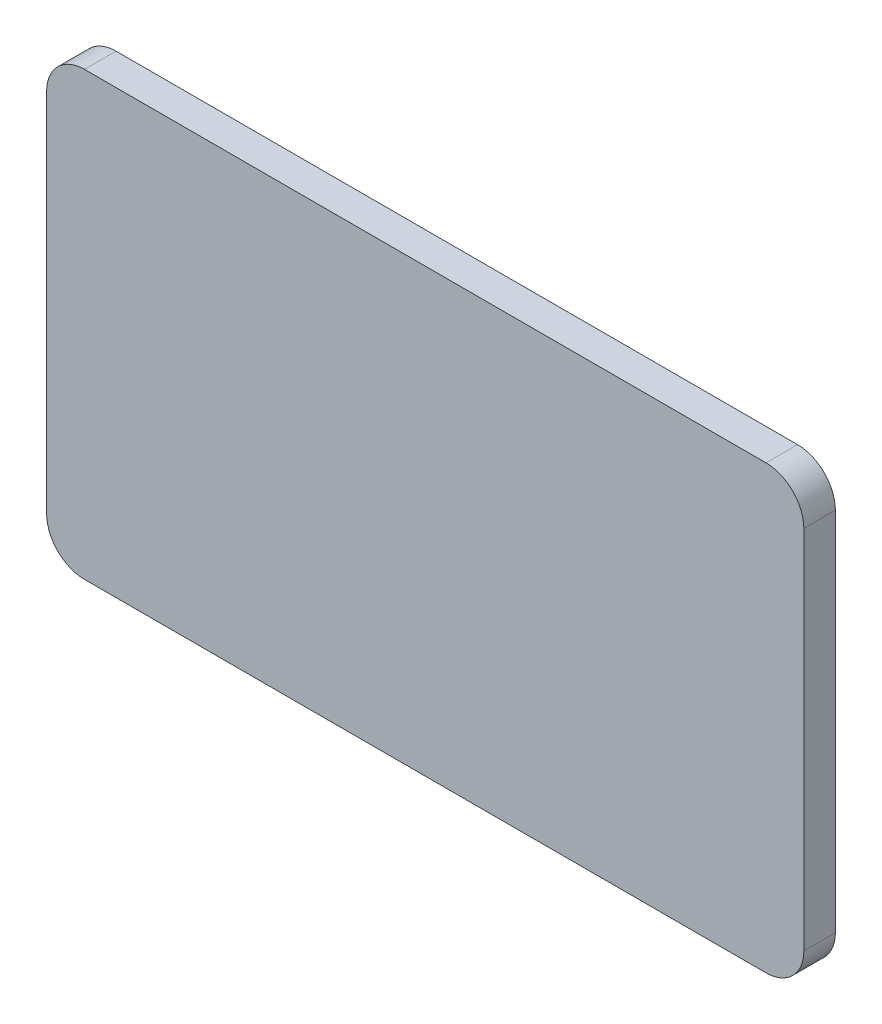
ISO-10303-21;
HEADER;
FILE_DESCRIPTION(('STEP AP214'),'2;1');
FILE_NAME('part.step','',(''),(''),'','','');
FILE_SCHEMA(('AUTOMOTIVE_DESIGN { 1 0 10303 214 1 1 1 1 }'));
ENDSEC;
DATA;
#1=APPLICATION_CONTEXT('core data for automotive mechanical design processes');
#2=APPLICATION_PROTOCOL_DEFINITION('international standard','automotive_design',2000,#1);
#3=PRODUCT_CONTEXT('',#1,'mechanical');
#4=PRODUCT('Part','Part','',(#3));
#5=PRODUCT_RELATED_PRODUCT_CATEGORY('part','',(#4));
#6=PRODUCT_DEFINITION_FORMATION('','',#4);
#7=PRODUCT_DEFINITION_CONTEXT('part definition',#1,'design');
#8=PRODUCT_DEFINITION('design','',#6,#7);
#9=PRODUCT_DEFINITION_SHAPE('','',#8);
#10=(LENGTH_UNIT() NAMED_UNIT(*) SI_UNIT(.MILLI.,.METRE.));
#11=(NAMED_UNIT(*) PLANE_ANGLE_UNIT() SI_UNIT($,.RADIAN.));
#12=(NAMED_UNIT(*) SI_UNIT($,.STERADIAN.) SOLID_ANGLE_UNIT());
#13=UNCERTAINTY_MEASURE_WITH_UNIT(LENGTH_MEASURE(1.E-05),#10,'distance_accuracy_value','');
#14=(GEOMETRIC_REPRESENTATION_CONTEXT(3) GLOBAL_UNCERTAINTY_ASSIGNED_CONTEXT((#13)) GLOBAL_UNIT_ASSIGNED_CONTEXT((#10,
#11,#12)) REPRESENTATION_CONTEXT('',''));
#15=CARTESIAN_POINT('',(0.,0.,0.));
#16=DIRECTION('',(0.,0.,1.));
#17=DIRECTION('',(1.,0.,0.));
#18=AXIS2_PLACEMENT_3D('',#15,#16,#17);
#19=CARTESIAN_POINT('',(27.,-14.5,2.5));
#20=DIRECTION('',(0.,0.,-1.));
#21=DIRECTION('',(-1.,0.,0.));
#22=AXIS2_PLACEMENT_3D('',#19,#20,#21);
#23=CYLINDRICAL_SURFACE('',#22,3.);
#24=CARTESIAN_POINT('',(27.,-14.5,0.));
#25=DIRECTION('',(0.,0.,1.));
#26=DIRECTION('',(1.,0.,0.));
#27=AXIS2_PLACEMENT_3D('',#24,#25,#26);
#28=CIRCLE('',#27,3.);
#29=CARTESIAN_POINT('',(27.,-17.5,0.));
#30=VERTEX_POINT('',#29);
#31=CARTESIAN_POINT('',(30.,-14.5,0.));
#32=VERTEX_POINT('',#31);
#33=EDGE_CURVE('E128',#30,#32,#28,.T.);
#34=ORIENTED_EDGE('',*,*,#33,.T.);
#35=DIRECTION('',(0.,0.,-1.));
#36=VECTOR('',#35,1.);
#37=CARTESIAN_POINT('',(30.,-14.5,2.5));
#38=LINE('',#37,#36);
#39=CARTESIAN_POINT('',(30.,-14.5,2.5));
#40=VERTEX_POINT('',#39);
#41=EDGE_CURVE('E11',#40,#32,#38,.T.);
#42=ORIENTED_EDGE('',*,*,#41,.F.);
#43=CARTESIAN_POINT('',(27.,-14.5,2.5));
#44=DIRECTION('',(0.,0.,1.));
#45=DIRECTION('',(1.,0.,0.));
#46=AXIS2_PLACEMENT_3D('',#43,#44,#45);
#47=CIRCLE('',#46,3.);
#48=CARTESIAN_POINT('',(27.,-17.5,2.5));
#49=VERTEX_POINT('',#48);
#50=EDGE_CURVE('E142',#49,#40,#47,.T.);
#51=ORIENTED_EDGE('',*,*,#50,.F.);
#52=DIRECTION('',(0.,0.,-1.));
#53=VECTOR('',#52,1.);
#54=CARTESIAN_POINT('',(27.,-17.5,2.5));
#55=LINE('',#54,#53);
#56=EDGE_CURVE('E124',#49,#30,#55,.T.);
#57=ORIENTED_EDGE('',*,*,#56,.T.);
#58=EDGE_LOOP('',(#34,#42,#51,#57));
#59=FACE_BOUND('',#58,.T.);
#60=ADVANCED_FACE('F32',(#59),#23,.T.);
#61=CARTESIAN_POINT('',(30.,-14.5,2.5));
#62=DIRECTION('',(-1.,0.,0.));
#63=DIRECTION('',(0.,0.,1.));
#64=AXIS2_PLACEMENT_3D('',#61,#62,#63);
#65=PLANE('',#64);
#66=DIRECTION('',(0.,1.,0.));
#67=VECTOR('',#66,1.);
#68=CARTESIAN_POINT('',(30.,-14.5,0.));
#69=LINE('',#68,#67);
#70=CARTESIAN_POINT('',(30.,14.5,0.));
#71=VERTEX_POINT('',#70);
#72=EDGE_CURVE('E131',#32,#71,#69,.T.);
#73=ORIENTED_EDGE('',*,*,#72,.T.);
#74=DIRECTION('',(0.,0.,-1.));
#75=VECTOR('',#74,1.);
#76=CARTESIAN_POINT('',(30.,14.5,2.5));
#77=LINE('',#76,#75);
#78=CARTESIAN_POINT('',(30.,14.5,2.5));
#79=VERTEX_POINT('',#78);
#80=EDGE_CURVE('E40',#79,#71,#77,.T.);
#81=ORIENTED_EDGE('',*,*,#80,.F.);
#82=DIRECTION('',(0.,1.,0.));
#83=VECTOR('',#82,1.);
#84=CARTESIAN_POINT('',(30.,-14.5,2.5));
#85=LINE('',#84,#83);
#86=EDGE_CURVE('E91',#40,#79,#85,.T.);
#87=ORIENTED_EDGE('',*,*,#86,.F.);
#88=ORIENTED_EDGE('',*,*,#41,.T.);
#89=EDGE_LOOP('',(#73,#81,#87,#88));
#90=FACE_BOUND('',#89,.T.);
#91=ADVANCED_FACE('F177',(#90),#65,.F.);
#92=CARTESIAN_POINT('',(27.,14.5,2.5));
#93=DIRECTION('',(0.,0.,-1.));
#94=DIRECTION('',(-1.,0.,0.));
#95=AXIS2_PLACEMENT_3D('',#92,#93,#94);
#96=CYLINDRICAL_SURFACE('',#95,3.);
#97=CARTESIAN_POINT('',(27.,14.5,0.));
#98=DIRECTION('',(0.,0.,1.));
#99=DIRECTION('',(-1.,0.,0.));
#100=AXIS2_PLACEMENT_3D('',#97,#98,#99);
#101=CIRCLE('',#100,3.);
#102=CARTESIAN_POINT('',(27.,17.5,0.));
#103=VERTEX_POINT('',#102);
#104=EDGE_CURVE('E133',#71,#103,#101,.T.);
#105=ORIENTED_EDGE('',*,*,#104,.T.);
#106=DIRECTION('',(0.,0.,-1.));
#107=VECTOR('',#106,1.);
#108=CARTESIAN_POINT('',(27.,17.5,2.5));
#109=LINE('',#108,#107);
#110=CARTESIAN_POINT('',(27.,17.5,2.5));
#111=VERTEX_POINT('',#110);
#112=EDGE_CURVE('E149',#111,#103,#109,.T.);
#113=ORIENTED_EDGE('',*,*,#112,.F.);
#114=CARTESIAN_POINT('',(27.,14.5,2.5));
#115=DIRECTION('',(0.,0.,1.));
#116=DIRECTION('',(-1.,0.,0.));
#117=AXIS2_PLACEMENT_3D('',#114,#115,#116);
#118=CIRCLE('',#117,3.);
#119=EDGE_CURVE('E157',#79,#111,#118,.T.);
#120=ORIENTED_EDGE('',*,*,#119,.F.);
#121=ORIENTED_EDGE('',*,*,#80,.T.);
#122=EDGE_LOOP('',(#105,#113,#120,#121));
#123=FACE_BOUND('',#122,.T.);
#124=ADVANCED_FACE('F155',(#123),#96,.T.);
#125=CARTESIAN_POINT('',(-27.,17.5,2.5));
#126=DIRECTION('',(0.,-1.,0.));
#127=DIRECTION('',(0.,0.,-1.));
#128=AXIS2_PLACEMENT_3D('',#125,#126,#127);
#129=PLANE('',#128);
#130=DIRECTION('',(-1.,0.,0.));
#131=VECTOR('',#130,1.);
#132=CARTESIAN_POINT('',(-27.,17.5,0.));
#133=LINE('',#132,#131);
#134=CARTESIAN_POINT('',(-27.,17.5,0.));
#135=VERTEX_POINT('',#134);
#136=EDGE_CURVE('E135',#103,#135,#133,.T.);
#137=ORIENTED_EDGE('',*,*,#136,.T.);
#138=DIRECTION('',(0.,0.,-1.));
#139=VECTOR('',#138,1.);
#140=CARTESIAN_POINT('',(-27.,17.5,2.5));
#141=LINE('',#140,#139);
#142=CARTESIAN_POINT('',(-27.,17.5,2.5));
#143=VERTEX_POINT('',#142);
#144=EDGE_CURVE('E146',#143,#135,#141,.T.);
#145=ORIENTED_EDGE('',*,*,#144,.F.);
#146=DIRECTION('',(-1.,0.,0.));
#147=VECTOR('',#146,1.);
#148=CARTESIAN_POINT('',(-27.,17.5,2.5));
#149=LINE('',#148,#147);
#150=EDGE_CURVE('E169',#111,#143,#149,.T.);
#151=ORIENTED_EDGE('',*,*,#150,.F.);
#152=ORIENTED_EDGE('',*,*,#112,.T.);
#153=EDGE_LOOP('',(#137,#145,#151,#152));
#154=FACE_BOUND('',#153,.T.);
#155=ADVANCED_FACE('F165',(#154),#129,.F.);
#156=CARTESIAN_POINT('',(-27.,14.5,2.5));
#157=DIRECTION('',(0.,0.,-1.));
#158=DIRECTION('',(-1.,0.,0.));
#159=AXIS2_PLACEMENT_3D('',#156,#157,#158);
#160=CYLINDRICAL_SURFACE('',#159,3.);
#161=CARTESIAN_POINT('',(-27.,14.5,0.));
#162=DIRECTION('',(0.,0.,1.));
#163=DIRECTION('',(-1.,0.,0.));
#164=AXIS2_PLACEMENT_3D('',#161,#162,#163);
#165=CIRCLE('',#164,3.);
#166=CARTESIAN_POINT('',(-30.,14.5,0.));
#167=VERTEX_POINT('',#166);
#168=EDGE_CURVE('E137',#135,#167,#165,.T.);
#169=ORIENTED_EDGE('',*,*,#168,.T.);
#170=DIRECTION('',(0.,0.,-1.));
#171=VECTOR('',#170,1.);
#172=CARTESIAN_POINT('',(-30.,14.5,2.5));
#173=LINE('',#172,#171);
#174=CARTESIAN_POINT('',(-30.,14.5,2.5));
#175=VERTEX_POINT('',#174);
#176=EDGE_CURVE('E119',#175,#167,#173,.T.);
#177=ORIENTED_EDGE('',*,*,#176,.F.);
#178=CARTESIAN_POINT('',(-27.,14.5,2.5));
#179=DIRECTION('',(0.,0.,1.));
#180=DIRECTION('',(-1.,0.,0.));
#181=AXIS2_PLACEMENT_3D('',#178,#179,#180);
#182=CIRCLE('',#181,3.);
#183=EDGE_CURVE('E110',#143,#175,#182,.T.);
#184=ORIENTED_EDGE('',*,*,#183,.F.);
#185=ORIENTED_EDGE('',*,*,#144,.T.);
#186=EDGE_LOOP('',(#169,#177,#184,#185));
#187=FACE_BOUND('',#186,.T.);
#188=ADVANCED_FACE('F168',(#187),#160,.T.);
#189=CARTESIAN_POINT('',(-30.,-14.5,2.5));
#190=DIRECTION('',(1.,0.,0.));
#191=DIRECTION('',(0.,0.,-1.));
#192=AXIS2_PLACEMENT_3D('',#189,#190,#191);
#193=PLANE('',#192);
#194=DIRECTION('',(0.,-1.,0.));
#195=VECTOR('',#194,1.);
#196=CARTESIAN_POINT('',(-30.,-14.5,0.));
#197=LINE('',#196,#195);
#198=CARTESIAN_POINT('',(-30.,-14.5,0.));
#199=VERTEX_POINT('',#198);
#200=EDGE_CURVE('E118',#167,#199,#197,.T.);
#201=ORIENTED_EDGE('',*,*,#200,.T.);
#202=DIRECTION('',(0.,0.,-1.));
#203=VECTOR('',#202,1.);
#204=CARTESIAN_POINT('',(-30.,-14.5,2.5));
#205=LINE('',#204,#203);
#206=CARTESIAN_POINT('',(-30.,-14.5,2.5));
#207=VERTEX_POINT('',#206);
#208=EDGE_CURVE('E115',#207,#199,#205,.T.);
#209=ORIENTED_EDGE('',*,*,#208,.F.);
#210=DIRECTION('',(0.,-1.,0.));
#211=VECTOR('',#210,1.);
#212=CARTESIAN_POINT('',(-30.,-14.5,2.5));
#213=LINE('',#212,#211);
#214=EDGE_CURVE('E104',#175,#207,#213,.T.);
#215=ORIENTED_EDGE('',*,*,#214,.F.);
#216=ORIENTED_EDGE('',*,*,#176,.T.);
#217=EDGE_LOOP('',(#201,#209,#215,#216));
#218=FACE_BOUND('',#217,.T.);
#219=ADVANCED_FACE('F116',(#218),#193,.F.);
#220=CARTESIAN_POINT('',(-27.,-14.5,2.5));
#221=DIRECTION('',(0.,0.,-1.));
#222=DIRECTION('',(-1.,0.,0.));
#223=AXIS2_PLACEMENT_3D('',#220,#221,#222);
#224=CYLINDRICAL_SURFACE('',#223,3.);
#225=CARTESIAN_POINT('',(-27.,-14.5,0.));
#226=DIRECTION('',(0.,0.,1.));
#227=DIRECTION('',(-1.,0.,0.));
#228=AXIS2_PLACEMENT_3D('',#225,#226,#227);
#229=CIRCLE('',#228,3.);
#230=CARTESIAN_POINT('',(-27.,-17.5,0.));
#231=VERTEX_POINT('',#230);
#232=EDGE_CURVE('E77',#199,#231,#229,.T.);
#233=ORIENTED_EDGE('',*,*,#232,.T.);
#234=DIRECTION('',(0.,0.,-1.));
#235=VECTOR('',#234,1.);
#236=CARTESIAN_POINT('',(-27.,-17.5,2.5));
#237=LINE('',#236,#235);
#238=CARTESIAN_POINT('',(-27.,-17.5,2.5));
#239=VERTEX_POINT('',#238);
#240=EDGE_CURVE('E120',#239,#231,#237,.T.);
#241=ORIENTED_EDGE('',*,*,#240,.F.);
#242=CARTESIAN_POINT('',(-27.,-14.5,2.5));
#243=DIRECTION('',(0.,0.,1.));
#244=DIRECTION('',(-1.,0.,0.));
#245=AXIS2_PLACEMENT_3D('',#242,#243,#244);
#246=CIRCLE('',#245,3.);
#247=EDGE_CURVE('E108',#207,#239,#246,.T.);
#248=ORIENTED_EDGE('',*,*,#247,.F.);
#249=ORIENTED_EDGE('',*,*,#208,.T.);
#250=EDGE_LOOP('',(#233,#241,#248,#249));
#251=FACE_BOUND('',#250,.T.);
#252=ADVANCED_FACE('F122',(#251),#224,.T.);
#253=CARTESIAN_POINT('',(-27.,-17.5,2.5));
#254=DIRECTION('',(0.,1.,0.));
#255=DIRECTION('',(0.,0.,1.));
#256=AXIS2_PLACEMENT_3D('',#253,#254,#255);
#257=PLANE('',#256);
#258=DIRECTION('',(1.,0.,0.));
#259=VECTOR('',#258,1.);
#260=CARTESIAN_POINT('',(-27.,-17.5,0.));
#261=LINE('',#260,#259);
#262=EDGE_CURVE('E83',#231,#30,#261,.T.);
#263=ORIENTED_EDGE('',*,*,#262,.T.);
#264=ORIENTED_EDGE('',*,*,#56,.F.);
#265=DIRECTION('',(1.,0.,0.));
#266=VECTOR('',#265,1.);
#267=CARTESIAN_POINT('',(-27.,-17.5,2.5));
#268=LINE('',#267,#266);
#269=EDGE_CURVE('E48',#239,#49,#268,.T.);
#270=ORIENTED_EDGE('',*,*,#269,.F.);
#271=ORIENTED_EDGE('',*,*,#240,.T.);
#272=EDGE_LOOP('',(#263,#264,#270,#271));
#273=FACE_BOUND('',#272,.T.);
#274=ADVANCED_FACE('F193',(#273),#257,.F.);
#275=CARTESIAN_POINT('',(27.,-14.5,2.5));
#276=DIRECTION('',(0.,0.,1.));
#277=DIRECTION('',(1.,0.,0.));
#278=AXIS2_PLACEMENT_3D('',#275,#276,#277);
#279=PLANE('',#278);
#280=ORIENTED_EDGE('',*,*,#50,.T.);
#281=ORIENTED_EDGE('',*,*,#86,.T.);
#282=ORIENTED_EDGE('',*,*,#119,.T.);
#283=ORIENTED_EDGE('',*,*,#150,.T.);
#284=ORIENTED_EDGE('',*,*,#183,.T.);
#285=ORIENTED_EDGE('',*,*,#214,.T.);
#286=ORIENTED_EDGE('',*,*,#247,.T.);
#287=ORIENTED_EDGE('',*,*,#269,.T.);
#288=EDGE_LOOP('',(#280,#281,#282,#283,#284,#285,#286,#287));
#289=FACE_BOUND('',#288,.T.);
#290=ADVANCED_FACE('F106',(#289),#279,.T.);
#291=CARTESIAN_POINT('',(27.,-14.5,0.));
#292=DIRECTION('',(0.,0.,1.));
#293=DIRECTION('',(1.,0.,0.));
#294=AXIS2_PLACEMENT_3D('',#291,#292,#293);
#295=PLANE('',#294);
#296=ORIENTED_EDGE('',*,*,#33,.F.);
#297=ORIENTED_EDGE('',*,*,#262,.F.);
#298=ORIENTED_EDGE('',*,*,#232,.F.);
#299=ORIENTED_EDGE('',*,*,#200,.F.);
#300=ORIENTED_EDGE('',*,*,#168,.F.);
#301=ORIENTED_EDGE('',*,*,#136,.F.);
#302=ORIENTED_EDGE('',*,*,#104,.F.);
#303=ORIENTED_EDGE('',*,*,#72,.F.);
#304=EDGE_LOOP('',(#296,#297,#298,#299,#300,#301,#302,#303));
#305=FACE_BOUND('',#304,.T.);
#306=ADVANCED_FACE('F161',(#305),#295,.F.);
#307=CLOSED_SHELL('',(#60,#91,#124,#155,#188,#219,#252,#274,#290,#306));
#308=MANIFOLD_SOLID_BREP('B2',#307);
#309=ADVANCED_BREP_SHAPE_REPRESENTATION('',(#18,#308),#14);
#310=SHAPE_DEFINITION_REPRESENTATION(#9,#309);
ENDSEC;
END-ISO-10303-21;
